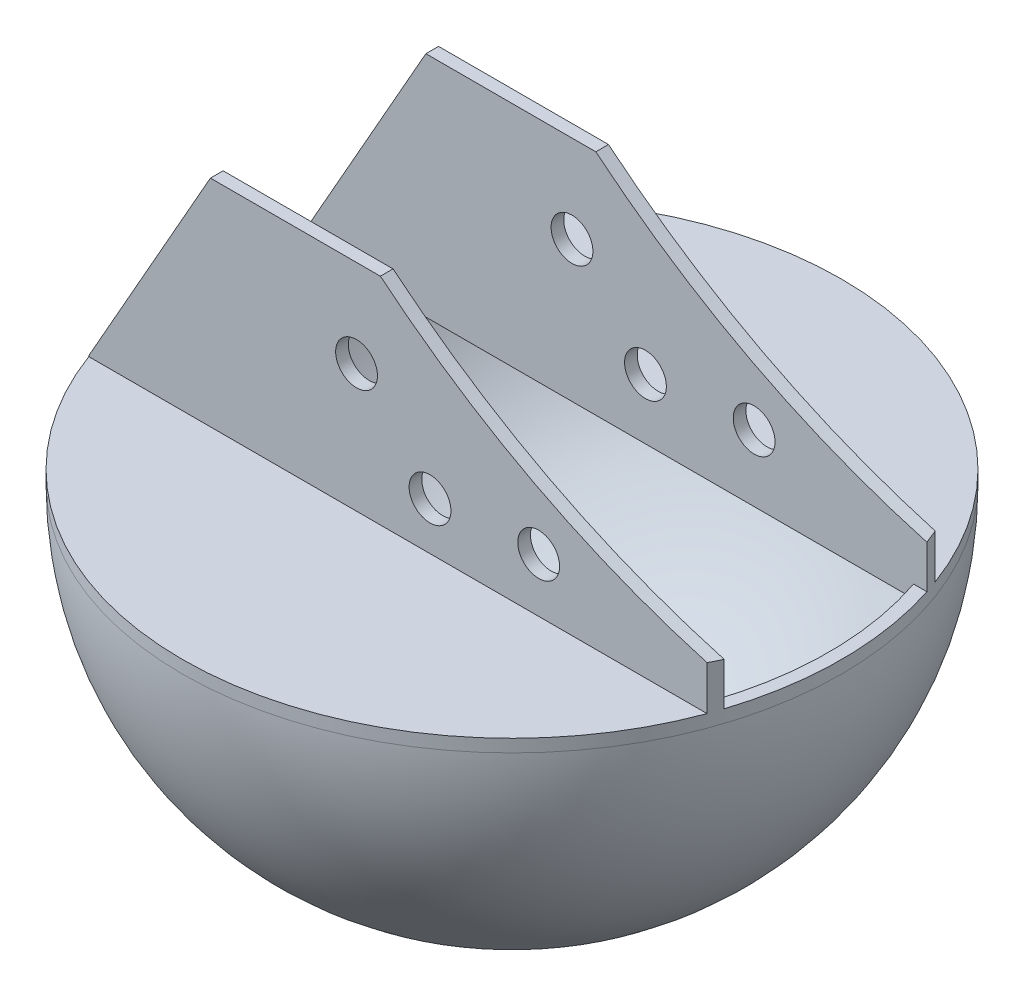
ISO-10303-21;
HEADER;
FILE_DESCRIPTION(('STEP AP214'),'2;1');
FILE_NAME('part.step','',(''),(''),'','','');
FILE_SCHEMA(('AUTOMOTIVE_DESIGN { 1 0 10303 214 1 1 1 1 }'));
ENDSEC;
DATA;
#1=APPLICATION_CONTEXT('core data for automotive mechanical design processes');
#2=APPLICATION_PROTOCOL_DEFINITION('international standard','automotive_design',2000,#1);
#3=PRODUCT_CONTEXT('',#1,'mechanical');
#4=PRODUCT('Part','Part','',(#3));
#5=PRODUCT_RELATED_PRODUCT_CATEGORY('part','',(#4));
#6=PRODUCT_DEFINITION_FORMATION('','',#4);
#7=PRODUCT_DEFINITION_CONTEXT('part definition',#1,'design');
#8=PRODUCT_DEFINITION('design','',#6,#7);
#9=PRODUCT_DEFINITION_SHAPE('','',#8);
#10=(LENGTH_UNIT() NAMED_UNIT(*) SI_UNIT(.MILLI.,.METRE.));
#11=(NAMED_UNIT(*) PLANE_ANGLE_UNIT() SI_UNIT($,.RADIAN.));
#12=(NAMED_UNIT(*) SI_UNIT($,.STERADIAN.) SOLID_ANGLE_UNIT());
#13=UNCERTAINTY_MEASURE_WITH_UNIT(LENGTH_MEASURE(1.E-05),#10,'distance_accuracy_value','');
#14=(GEOMETRIC_REPRESENTATION_CONTEXT(3) GLOBAL_UNCERTAINTY_ASSIGNED_CONTEXT((#13)) GLOBAL_UNIT_ASSIGNED_CONTEXT((#10,
#11,#12)) REPRESENTATION_CONTEXT('',''));
#15=CARTESIAN_POINT('',(0.,0.,0.));
#16=DIRECTION('',(0.,0.,1.));
#17=DIRECTION('',(1.,0.,0.));
#18=AXIS2_PLACEMENT_3D('',#15,#16,#17);
#19=CARTESIAN_POINT('',(-23.685438564654,0.,8.));
#20=DIRECTION('',(0.,0.,-1.));
#21=DIRECTION('',(-1.,0.,0.));
#22=AXIS2_PLACEMENT_3D('',#19,#20,#21);
#23=PLANE('',#22);
#24=CARTESIAN_POINT('',(43.7023148379366,72.6324172277184,8.));
#25=DIRECTION('',(0.,0.,-1.));
#26=DIRECTION('',(-1.,0.,0.));
#27=AXIS2_PLACEMENT_3D('',#24,#25,#26);
#28=CIRCLE('',#27,70.8348830128066);
#29=CARTESIAN_POINT('',(24.738633753706,4.38317216835103,7.99999999999999));
#30=VERTEX_POINT('',#29);
#31=CARTESIAN_POINT('',(-1.38515170537769,18.,8.00000000000017));
#32=VERTEX_POINT('',#31);
#33=EDGE_CURVE('E56',#30,#32,#28,.T.);
#34=ORIENTED_EDGE('',*,*,#33,.F.);
#35=DIRECTION('',(0.,-1.,0.));
#36=VECTOR('',#35,1.);
#37=CARTESIAN_POINT('',(24.738633753706,18.,7.99999999999999));
#38=LINE('',#37,#36);
#39=CARTESIAN_POINT('',(24.738633753706,1.,8.));
#40=VERTEX_POINT('',#39);
#41=EDGE_CURVE('E185',#30,#40,#38,.T.);
#42=ORIENTED_EDGE('',*,*,#41,.T.);
#43=DIRECTION('',(-1.,0.,0.));
#44=VECTOR('',#43,1.);
#45=CARTESIAN_POINT('',(23.685438564654,1.,8.));
#46=LINE('',#45,#44);
#47=CARTESIAN_POINT('',(23.685438564654,1.,8.));
#48=VERTEX_POINT('',#47);
#49=EDGE_CURVE('E181',#40,#48,#46,.T.);
#50=ORIENTED_EDGE('',*,*,#49,.T.);
#51=DIRECTION('',(0.,1.,0.));
#52=VECTOR('',#51,1.);
#53=CARTESIAN_POINT('',(23.685438564654,0.,8.));
#54=LINE('',#53,#52);
#55=CARTESIAN_POINT('',(23.685438564654,0.,8.));
#56=VERTEX_POINT('',#55);
#57=EDGE_CURVE('E295',#56,#48,#54,.T.);
#58=ORIENTED_EDGE('',*,*,#57,.F.);
#59=DIRECTION('',(-1.,0.,0.));
#60=VECTOR('',#59,1.);
#61=CARTESIAN_POINT('',(-23.685438564654,0.,8.));
#62=LINE('',#61,#60);
#63=CARTESIAN_POINT('',(-23.685438564654,0.,8.));
#64=VERTEX_POINT('',#63);
#65=EDGE_CURVE('E184',#56,#64,#62,.T.);
#66=ORIENTED_EDGE('',*,*,#65,.T.);
#67=DIRECTION('',(0.,1.,0.));
#68=VECTOR('',#67,1.);
#69=CARTESIAN_POINT('',(-23.685438564654,0.,8.));
#70=LINE('',#69,#68);
#71=CARTESIAN_POINT('',(-23.685438564654,1.,8.));
#72=VERTEX_POINT('',#71);
#73=EDGE_CURVE('E300',#64,#72,#70,.T.);
#74=ORIENTED_EDGE('',*,*,#73,.T.);
#75=CARTESIAN_POINT('',(-24.3926218353009,1.,8.));
#76=VERTEX_POINT('',#75);
#77=EDGE_CURVE('E186',#72,#76,#46,.T.);
#78=ORIENTED_EDGE('',*,*,#77,.T.);
#79=DIRECTION('',(-1.45758818449433E-13,-1.,0.));
#80=VECTOR('',#79,1.);
#81=CARTESIAN_POINT('',(-24.3926218353011,1.0307819795672E-13,8.));
#82=LINE('',#81,#80);
#83=CARTESIAN_POINT('',(-24.3926218353009,1.0714079667123,7.99999999999999));
#84=VERTEX_POINT('',#83);
#85=EDGE_CURVE('E326',#84,#76,#82,.T.);
#86=ORIENTED_EDGE('',*,*,#85,.F.);
#87=DIRECTION('',(-0.49316436078676,-0.869936154697451,0.));
#88=VECTOR('',#87,1.);
#89=CARTESIAN_POINT('',(-24.6802840847096,0.563975128899435,8.));
#90=LINE('',#89,#88);
#91=CARTESIAN_POINT('',(-14.7958505963591,18.,7.99999999999999));
#92=VERTEX_POINT('',#91);
#93=EDGE_CURVE('E210',#92,#84,#90,.T.);
#94=ORIENTED_EDGE('',*,*,#93,.F.);
#95=DIRECTION('',(-1.,0.,0.));
#96=VECTOR('',#95,1.);
#97=CARTESIAN_POINT('',(23.685438564654,18.,8.));
#98=LINE('',#97,#96);
#99=EDGE_CURVE('E176',#32,#92,#98,.T.);
#100=ORIENTED_EDGE('',*,*,#99,.F.);
#101=EDGE_LOOP('',(#34,#42,#50,#58,#66,#74,#78,#86,#94,#100));
#102=FACE_BOUND('',#101,.T.);
#103=CARTESIAN_POINT('',(11.1047679535459,5.24090867176932,8.));
#104=DIRECTION('',(0.,0.,-1.));
#105=DIRECTION('',(-1.,0.,0.));
#106=AXIS2_PLACEMENT_3D('',#103,#104,#105);
#107=CIRCLE('',#106,1.65000000000001);
#108=CARTESIAN_POINT('',(9.45476795354589,5.24090867176932,8.));
#109=VERTEX_POINT('',#108);
#110=EDGE_CURVE('E222',#109,#109,#107,.T.);
#111=ORIENTED_EDGE('',*,*,#110,.F.);
#112=EDGE_LOOP('',(#111));
#113=FACE_BOUND('',#112,.T.);
#114=CARTESIAN_POINT('',(2.530016956755,4.74483930901942,8.));
#115=DIRECTION('',(0.,0.,-1.));
#116=DIRECTION('',(-1.,0.,0.));
#117=AXIS2_PLACEMENT_3D('',#114,#115,#116);
#118=CIRCLE('',#117,1.65000000000001);
#119=CARTESIAN_POINT('',(0.880016956754995,4.74483930901942,8.));
#120=VERTEX_POINT('',#119);
#121=EDGE_CURVE('E238',#120,#120,#118,.T.);
#122=ORIENTED_EDGE('',*,*,#121,.F.);
#123=EDGE_LOOP('',(#122));
#124=FACE_BOUND('',#123,.T.);
#125=CARTESIAN_POINT('',(-3.26661902804232,11.0829345062674,8.));
#126=DIRECTION('',(0.,0.,-1.));
#127=DIRECTION('',(-1.,0.,0.));
#128=AXIS2_PLACEMENT_3D('',#125,#126,#127);
#129=CIRCLE('',#128,1.65);
#130=CARTESIAN_POINT('',(-4.91661902804231,11.0829345062674,8.));
#131=VERTEX_POINT('',#130);
#132=EDGE_CURVE('E234',#131,#131,#129,.T.);
#133=ORIENTED_EDGE('',*,*,#132,.F.);
#134=EDGE_LOOP('',(#133));
#135=FACE_BOUND('',#134,.T.);
#136=ADVANCED_FACE('F42',(#102,#113,#124,#135),#23,.T.);
#137=CARTESIAN_POINT('',(-23.685438564654,0.,-8.));
#138=DIRECTION('',(0.,0.,1.));
#139=DIRECTION('',(1.,0.,0.));
#140=AXIS2_PLACEMENT_3D('',#137,#138,#139);
#141=PLANE('',#140);
#142=CARTESIAN_POINT('',(43.7023148379366,72.6324172277184,-8.));
#143=DIRECTION('',(0.,0.,1.));
#144=DIRECTION('',(1.,0.,0.));
#145=AXIS2_PLACEMENT_3D('',#142,#143,#144);
#146=CIRCLE('',#145,70.8348830128066);
#147=CARTESIAN_POINT('',(-1.38515170537769,18.,-7.99999999999999));
#148=VERTEX_POINT('',#147);
#149=CARTESIAN_POINT('',(24.738633753706,4.38317216835103,-8.));
#150=VERTEX_POINT('',#149);
#151=EDGE_CURVE('E348',#148,#150,#146,.T.);
#152=ORIENTED_EDGE('',*,*,#151,.F.);
#153=DIRECTION('',(1.,0.,0.));
#154=VECTOR('',#153,1.);
#155=CARTESIAN_POINT('',(23.685438564654,18.,-8.));
#156=LINE('',#155,#154);
#157=CARTESIAN_POINT('',(-14.7958505963591,18.,-7.99999999999999));
#158=VERTEX_POINT('',#157);
#159=EDGE_CURVE('E207',#158,#148,#156,.T.);
#160=ORIENTED_EDGE('',*,*,#159,.F.);
#161=DIRECTION('',(0.49316436078676,0.869936154697451,0.));
#162=VECTOR('',#161,1.);
#163=CARTESIAN_POINT('',(-24.6802840847096,0.563975128899435,-8.));
#164=LINE('',#163,#162);
#165=CARTESIAN_POINT('',(-24.3926218353009,1.0714079667123,-8.));
#166=VERTEX_POINT('',#165);
#167=EDGE_CURVE('E206',#166,#158,#164,.T.);
#168=ORIENTED_EDGE('',*,*,#167,.F.);
#169=DIRECTION('',(1.45758818449433E-13,1.,0.));
#170=VECTOR('',#169,1.);
#171=CARTESIAN_POINT('',(-24.3926218353011,1.0307819795672E-13,-8.));
#172=LINE('',#171,#170);
#173=CARTESIAN_POINT('',(-24.3926218353009,1.,-8.00000000000032));
#174=VERTEX_POINT('',#173);
#175=EDGE_CURVE('E332',#174,#166,#172,.T.);
#176=ORIENTED_EDGE('',*,*,#175,.F.);
#177=DIRECTION('',(1.,0.,0.));
#178=VECTOR('',#177,1.);
#179=CARTESIAN_POINT('',(23.685438564654,1.,-8.));
#180=LINE('',#179,#178);
#181=CARTESIAN_POINT('',(-23.685438564654,1.,-8.));
#182=VERTEX_POINT('',#181);
#183=EDGE_CURVE('E200',#174,#182,#180,.T.);
#184=ORIENTED_EDGE('',*,*,#183,.T.);
#185=DIRECTION('',(0.,1.,0.));
#186=VECTOR('',#185,1.);
#187=CARTESIAN_POINT('',(-23.685438564654,0.,-8.));
#188=LINE('',#187,#186);
#189=CARTESIAN_POINT('',(-23.685438564654,0.,-8.));
#190=VERTEX_POINT('',#189);
#191=EDGE_CURVE('E258',#190,#182,#188,.T.);
#192=ORIENTED_EDGE('',*,*,#191,.F.);
#193=DIRECTION('',(1.,0.,0.));
#194=VECTOR('',#193,1.);
#195=CARTESIAN_POINT('',(-23.685438564654,0.,-8.));
#196=LINE('',#195,#194);
#197=CARTESIAN_POINT('',(23.685438564654,0.,-8.));
#198=VERTEX_POINT('',#197);
#199=EDGE_CURVE('E202',#190,#198,#196,.T.);
#200=ORIENTED_EDGE('',*,*,#199,.T.);
#201=DIRECTION('',(0.,1.,0.));
#202=VECTOR('',#201,1.);
#203=CARTESIAN_POINT('',(23.685438564654,0.,-8.));
#204=LINE('',#203,#202);
#205=CARTESIAN_POINT('',(23.685438564654,1.,-8.));
#206=VERTEX_POINT('',#205);
#207=EDGE_CURVE('E276',#198,#206,#204,.T.);
#208=ORIENTED_EDGE('',*,*,#207,.T.);
#209=CARTESIAN_POINT('',(24.738633753706,1.,-7.99999999999999));
#210=VERTEX_POINT('',#209);
#211=EDGE_CURVE('E203',#206,#210,#180,.T.);
#212=ORIENTED_EDGE('',*,*,#211,.T.);
#213=DIRECTION('',(0.,-1.,0.));
#214=VECTOR('',#213,1.);
#215=CARTESIAN_POINT('',(24.738633753706,18.,-7.99999999999999));
#216=LINE('',#215,#214);
#217=EDGE_CURVE('E196',#150,#210,#216,.T.);
#218=ORIENTED_EDGE('',*,*,#217,.F.);
#219=EDGE_LOOP('',(#152,#160,#168,#176,#184,#192,#200,#208,#212,#218));
#220=FACE_BOUND('',#219,.T.);
#221=CARTESIAN_POINT('',(11.1047679535459,5.24090867176932,-8.));
#222=DIRECTION('',(0.,0.,1.));
#223=DIRECTION('',(1.,0.,0.));
#224=AXIS2_PLACEMENT_3D('',#221,#222,#223);
#225=CIRCLE('',#224,1.65000000000001);
#226=CARTESIAN_POINT('',(12.7547679535459,5.24090867176932,-8.));
#227=VERTEX_POINT('',#226);
#228=EDGE_CURVE('E237',#227,#227,#225,.T.);
#229=ORIENTED_EDGE('',*,*,#228,.F.);
#230=EDGE_LOOP('',(#229));
#231=FACE_BOUND('',#230,.T.);
#232=CARTESIAN_POINT('',(2.530016956755,4.74483930901942,-8.));
#233=DIRECTION('',(0.,0.,1.));
#234=DIRECTION('',(1.,0.,0.));
#235=AXIS2_PLACEMENT_3D('',#232,#233,#234);
#236=CIRCLE('',#235,1.65000000000001);
#237=CARTESIAN_POINT('',(4.18001695675501,4.74483930901942,-8.));
#238=VERTEX_POINT('',#237);
#239=EDGE_CURVE('E233',#238,#238,#236,.T.);
#240=ORIENTED_EDGE('',*,*,#239,.F.);
#241=EDGE_LOOP('',(#240));
#242=FACE_BOUND('',#241,.T.);
#243=CARTESIAN_POINT('',(-3.26661902804232,11.0829345062674,-8.));
#244=DIRECTION('',(0.,0.,1.));
#245=DIRECTION('',(1.,0.,0.));
#246=AXIS2_PLACEMENT_3D('',#243,#244,#245);
#247=CIRCLE('',#246,1.65);
#248=CARTESIAN_POINT('',(-1.61661902804232,11.0829345062674,-8.));
#249=VERTEX_POINT('',#248);
#250=EDGE_CURVE('E228',#249,#249,#247,.T.);
#251=ORIENTED_EDGE('',*,*,#250,.F.);
#252=EDGE_LOOP('',(#251));
#253=FACE_BOUND('',#252,.T.);
#254=ADVANCED_FACE('F370',(#220,#231,#242,#253),#141,.T.);
#255=CARTESIAN_POINT('',(0.,1.,0.));
#256=DIRECTION('',(0.,1.,0.));
#257=DIRECTION('',(0.,0.,1.));
#258=AXIS2_PLACEMENT_3D('',#255,#256,#257);
#259=PLANE('',#258);
#260=DIRECTION('',(-1.,0.,0.));
#261=VECTOR('',#260,1.);
#262=CARTESIAN_POINT('',(-24.3926218353009,1.,-8.99999999999999));
#263=LINE('',#262,#261);
#264=CARTESIAN_POINT('',(24.3926218353009,1.,-8.99999999999999));
#265=VERTEX_POINT('',#264);
#266=CARTESIAN_POINT('',(-24.3926218353009,1.,-8.99999999999999));
#267=VERTEX_POINT('',#266);
#268=EDGE_CURVE('E174',#265,#267,#263,.T.);
#269=ORIENTED_EDGE('',*,*,#268,.F.);
#270=CARTESIAN_POINT('',(0.,1.,0.));
#271=DIRECTION('',(0.,1.,0.));
#272=DIRECTION('',(0.,0.,1.));
#273=AXIS2_PLACEMENT_3D('',#270,#271,#272);
#274=CIRCLE('',#273,26.);
#275=EDGE_CURVE('E263',#265,#267,#274,.T.);
#276=ORIENTED_EDGE('',*,*,#275,.T.);
#277=EDGE_LOOP('',(#269,#276));
#278=FACE_BOUND('',#277,.T.);
#279=ADVANCED_FACE('F421',(#278),#259,.T.);
#280=ORIENTED_EDGE('',*,*,#183,.F.);
#281=DIRECTION('',(0.,0.,1.));
#282=VECTOR('',#281,1.);
#283=CARTESIAN_POINT('',(-24.3926218353009,1.,-15.));
#284=LINE('',#283,#282);
#285=EDGE_CURVE('E337',#267,#174,#284,.T.);
#286=ORIENTED_EDGE('',*,*,#285,.F.);
#287=CARTESIAN_POINT('',(-24.3926218353009,1.,8.99999999999999));
#288=VERTEX_POINT('',#287);
#289=EDGE_CURVE('E257',#267,#288,#274,.T.);
#290=ORIENTED_EDGE('',*,*,#289,.T.);
#291=EDGE_CURVE('E335',#76,#288,#284,.T.);
#292=ORIENTED_EDGE('',*,*,#291,.F.);
#293=ORIENTED_EDGE('',*,*,#77,.F.);
#294=CARTESIAN_POINT('',(0.,1.,0.));
#295=DIRECTION('',(0.,1.,0.));
#296=DIRECTION('',(0.,0.,1.));
#297=AXIS2_PLACEMENT_3D('',#294,#295,#296);
#298=CIRCLE('',#297,25.);
#299=EDGE_CURVE('E261',#182,#72,#298,.T.);
#300=ORIENTED_EDGE('',*,*,#299,.F.);
#301=EDGE_LOOP('',(#280,#286,#290,#292,#293,#300));
#302=FACE_BOUND('',#301,.T.);
#303=ADVANCED_FACE('F387',(#302),#259,.T.);
#304=DIRECTION('',(1.,0.,0.));
#305=VECTOR('',#304,1.);
#306=CARTESIAN_POINT('',(-24.3926218353009,1.,8.99999999999999));
#307=LINE('',#306,#305);
#308=CARTESIAN_POINT('',(24.3926218353009,1.,8.99999999999999));
#309=VERTEX_POINT('',#308);
#310=EDGE_CURVE('E187',#288,#309,#307,.T.);
#311=ORIENTED_EDGE('',*,*,#310,.F.);
#312=EDGE_CURVE('E251',#288,#309,#274,.T.);
#313=ORIENTED_EDGE('',*,*,#312,.T.);
#314=EDGE_LOOP('',(#311,#313));
#315=FACE_BOUND('',#314,.T.);
#316=ADVANCED_FACE('F250',(#315),#259,.T.);
#317=CARTESIAN_POINT('',(0.,1.,0.));
#318=DIRECTION('',(0.,-1.,0.));
#319=DIRECTION('',(0.,0.,-1.));
#320=AXIS2_PLACEMENT_3D('',#317,#318,#319);
#321=CYLINDRICAL_SURFACE('',#320,25.);
#322=ORIENTED_EDGE('',*,*,#191,.T.);
#323=ORIENTED_EDGE('',*,*,#299,.T.);
#324=ORIENTED_EDGE('',*,*,#73,.F.);
#325=CARTESIAN_POINT('',(0.,0.,0.));
#326=DIRECTION('',(0.,1.,0.));
#327=DIRECTION('',(0.,0.,1.));
#328=AXIS2_PLACEMENT_3D('',#325,#326,#327);
#329=CIRCLE('',#328,25.);
#330=EDGE_CURVE('E288',#190,#64,#329,.T.);
#331=ORIENTED_EDGE('',*,*,#330,.F.);
#332=EDGE_LOOP('',(#322,#323,#324,#331));
#333=FACE_BOUND('',#332,.T.);
#334=ADVANCED_FACE('F394',(#333),#321,.F.);
#335=CARTESIAN_POINT('',(0.,0.,0.));
#336=DIRECTION('',(0.,1.,0.));
#337=DIRECTION('',(1.,0.,0.));
#338=AXIS2_PLACEMENT_3D('',#335,#336,#337);
#339=SPHERICAL_SURFACE('',#338,26.);
#340=CARTESIAN_POINT('',(0.,0.,0.));
#341=DIRECTION('',(0.,1.,0.));
#342=DIRECTION('',(0.,0.,1.));
#343=AXIS2_PLACEMENT_3D('',#340,#341,#342);
#344=CIRCLE('',#343,26.);
#345=CARTESIAN_POINT('',(0.,0.,26.));
#346=VERTEX_POINT('',#345);
#347=EDGE_CURVE('E219',#346,#346,#344,.T.);
#348=ORIENTED_EDGE('',*,*,#347,.F.);
#349=EDGE_LOOP('',(#348));
#350=FACE_BOUND('',#349,.T.);
#351=ADVANCED_FACE('F605',(#350),#339,.T.);
#352=ORIENTED_EDGE('',*,*,#211,.F.);
#353=EDGE_CURVE('E272',#48,#206,#298,.T.);
#354=ORIENTED_EDGE('',*,*,#353,.F.);
#355=ORIENTED_EDGE('',*,*,#49,.F.);
#356=EDGE_CURVE('E224',#40,#210,#274,.T.);
#357=ORIENTED_EDGE('',*,*,#356,.T.);
#358=EDGE_LOOP('',(#352,#354,#355,#357));
#359=FACE_BOUND('',#358,.T.);
#360=ADVANCED_FACE('F399',(#359),#259,.T.);
#361=CARTESIAN_POINT('',(0.,1.,0.));
#362=DIRECTION('',(0.,-1.,0.));
#363=DIRECTION('',(0.,0.,-1.));
#364=AXIS2_PLACEMENT_3D('',#361,#362,#363);
#365=CYLINDRICAL_SURFACE('',#364,26.);
#366=DIRECTION('',(0.,-1.,0.));
#367=VECTOR('',#366,1.);
#368=CARTESIAN_POINT('',(24.3926218353009,18.,-8.99999999999999));
#369=LINE('',#368,#367);
#370=CARTESIAN_POINT('',(24.3926218353009,4.48026093327714,-8.99999999999999));
#371=VERTEX_POINT('',#370);
#372=EDGE_CURVE('E172',#371,#265,#369,.T.);
#373=ORIENTED_EDGE('',*,*,#372,.F.);
#374=CARTESIAN_POINT('',(23.0651251893416,4.87042895371695,-12.));
#375=CARTESIAN_POINT('',(23.2316855557632,4.81970533224708,-11.6798706596151));
#376=CARTESIAN_POINT('',(23.3917396279807,4.77162827203275,-11.3559382741795));
#377=CARTESIAN_POINT('',(23.6981725724189,4.68066567135373,-10.7017173082048));
#378=CARTESIAN_POINT('',(23.8445768646514,4.63777043483787,-10.3714419825001));
#379=CARTESIAN_POINT('',(24.1236835953816,4.55687849553774,-9.70456330835858));
#380=CARTESIAN_POINT('',(24.256386045794,4.51888178849383,-9.36795996542481));
#381=CARTESIAN_POINT('',(24.5080178236296,4.4475463852596,-8.68842162294103));
#382=CARTESIAN_POINT('',(24.6269204353232,4.41421669924316,-8.34547578441792));
#383=CARTESIAN_POINT('',(24.738633753706,4.38317216835103,-8.));
#384=B_SPLINE_CURVE_WITH_KNOTS('',3,(#374,#375,#376,#377,#378,#379,#380,#381,#382,#383),
.UNSPECIFIED.,.F.,.F.,(4,2,2,2,4),(0.,1.09315483432454,2.18423142568867,3.27530706827258,
4.36846093102751),.UNSPECIFIED.);
#385=EDGE_CURVE('E359',#371,#150,#384,.T.);
#386=ORIENTED_EDGE('',*,*,#385,.T.);
#387=ORIENTED_EDGE('',*,*,#217,.T.);
#388=ORIENTED_EDGE('',*,*,#356,.F.);
#389=ORIENTED_EDGE('',*,*,#41,.F.);
#390=CARTESIAN_POINT('',(24.738633753706,4.38317216835103,8.));
#391=CARTESIAN_POINT('',(24.6843240159089,4.39825346920659,8.16793570455722));
#392=CARTESIAN_POINT('',(24.6283348204764,4.41388485004495,8.33523689016994));
#393=CARTESIAN_POINT('',(24.5129975143413,4.446247771687,8.66857022350325));
#394=CARTESIAN_POINT('',(24.4536494036388,4.46297931249067,8.83460237122386));
#395=CARTESIAN_POINT('',(24.3926218353009,4.48026093327713,9.));
#396=B_SPLINE_CURVE_WITH_KNOTS('',3,(#390,#391,#392,#393,#394,#395),.UNSPECIFIED.,.F.,.F.,(4,2,
4),(0.,0.531337323190933,1.06267464637178),.UNSPECIFIED.);
#397=CARTESIAN_POINT('',(24.3926218353009,4.48026093327714,8.99999999999999));
#398=VERTEX_POINT('',#397);
#399=EDGE_CURVE('E341',#30,#398,#396,.T.);
#400=ORIENTED_EDGE('',*,*,#399,.T.);
#401=DIRECTION('',(0.,-1.,0.));
#402=VECTOR('',#401,1.);
#403=CARTESIAN_POINT('',(24.3926218353009,18.,8.99999999999999));
#404=LINE('',#403,#402);
#405=EDGE_CURVE('E166',#398,#309,#404,.T.);
#406=ORIENTED_EDGE('',*,*,#405,.T.);
#407=ORIENTED_EDGE('',*,*,#312,.F.);
#408=ORIENTED_EDGE('',*,*,#289,.F.);
#409=ORIENTED_EDGE('',*,*,#275,.F.);
#410=EDGE_LOOP('',(#373,#386,#387,#388,#389,#400,#406,#407,#408,#409));
#411=FACE_BOUND('',#410,.T.);
#412=ORIENTED_EDGE('',*,*,#347,.T.);
#413=EDGE_LOOP('',(#412));
#414=FACE_BOUND('',#413,.T.);
#415=ADVANCED_FACE('F254',(#411,#414),#365,.T.);
#416=ORIENTED_EDGE('',*,*,#207,.F.);
#417=EDGE_CURVE('E289',#56,#198,#329,.T.);
#418=ORIENTED_EDGE('',*,*,#417,.F.);
#419=ORIENTED_EDGE('',*,*,#57,.T.);
#420=ORIENTED_EDGE('',*,*,#353,.T.);
#421=EDGE_LOOP('',(#416,#418,#419,#420));
#422=FACE_BOUND('',#421,.T.);
#423=ADVANCED_FACE('F398',(#422),#321,.F.);
#424=CARTESIAN_POINT('',(0.,0.,0.));
#425=DIRECTION('',(0.,0.,-1.));
#426=DIRECTION('',(1.,0.,0.));
#427=AXIS2_PLACEMENT_3D('',#424,#425,#426);
#428=SPHERICAL_SURFACE('',#427,25.);
#429=CARTESIAN_POINT('',(0.,0.,0.));
#430=DIRECTION('',(0.,1.,0.));
#431=DIRECTION('',(0.,0.,1.));
#432=AXIS2_PLACEMENT_3D('',#429,#430,#431);
#433=SPHERICAL_SURFACE('',#432,25.);
#434=ORIENTED_EDGE('',*,*,#417,.T.);
#435=CARTESIAN_POINT('',(0.,0.,0.));
#436=DIRECTION('',(0.,1.,0.));
#437=DIRECTION('',(0.,0.,1.));
#438=AXIS2_PLACEMENT_3D('',#435,#436,#437);
#439=CIRCLE('',#438,25.);
#440=EDGE_CURVE('E286',#198,#190,#439,.T.);
#441=ORIENTED_EDGE('',*,*,#440,.T.);
#442=ORIENTED_EDGE('',*,*,#330,.T.);
#443=CARTESIAN_POINT('',(0.,0.,0.));
#444=DIRECTION('',(0.,1.,0.));
#445=DIRECTION('',(0.,0.,1.));
#446=AXIS2_PLACEMENT_3D('',#443,#444,#445);
#447=CIRCLE('',#446,25.);
#448=EDGE_CURVE('E192',#64,#56,#447,.T.);
#449=ORIENTED_EDGE('',*,*,#448,.T.);
#450=EDGE_LOOP('',(#434,#441,#442,#449));
#451=FACE_BOUND('',#450,.T.);
#452=ADVANCED_FACE('F396',(#451),#433,.F.);
#453=CARTESIAN_POINT('',(0.,0.,0.));
#454=DIRECTION('',(0.,1.,0.));
#455=DIRECTION('',(0.,0.,1.));
#456=AXIS2_PLACEMENT_3D('',#453,#454,#455);
#457=PLANE('',#456);
#458=ORIENTED_EDGE('',*,*,#448,.F.);
#459=ORIENTED_EDGE('',*,*,#65,.F.);
#460=EDGE_LOOP('',(#458,#459));
#461=FACE_BOUND('',#460,.T.);
#462=ADVANCED_FACE('F404',(#461),#457,.F.);
#463=CARTESIAN_POINT('',(0.,0.,0.));
#464=DIRECTION('',(0.,1.,0.));
#465=DIRECTION('',(0.,0.,1.));
#466=AXIS2_PLACEMENT_3D('',#463,#464,#465);
#467=PLANE('',#466);
#468=ORIENTED_EDGE('',*,*,#440,.F.);
#469=ORIENTED_EDGE('',*,*,#199,.F.);
#470=EDGE_LOOP('',(#468,#469));
#471=FACE_BOUND('',#470,.T.);
#472=ADVANCED_FACE('F406',(#471),#467,.F.);
#473=CARTESIAN_POINT('',(-24.3926218353009,18.,8.99999999999999));
#474=DIRECTION('',(0.,0.,-1.));
#475=DIRECTION('',(-1.,0.,0.));
#476=AXIS2_PLACEMENT_3D('',#473,#474,#475);
#477=PLANE('',#476);
#478=CARTESIAN_POINT('',(11.1047679535459,5.24090867176932,8.99999999999999));
#479=DIRECTION('',(0.,0.,1.));
#480=DIRECTION('',(1.,0.,0.));
#481=AXIS2_PLACEMENT_3D('',#478,#479,#480);
#482=CIRCLE('',#481,1.65000000000001);
#483=CARTESIAN_POINT('',(12.7547679535459,5.24090867176932,8.99999999999999));
#484=VERTEX_POINT('',#483);
#485=EDGE_CURVE('E229',#484,#484,#482,.T.);
#486=ORIENTED_EDGE('',*,*,#485,.F.);
#487=EDGE_LOOP('',(#486));
#488=FACE_BOUND('',#487,.T.);
#489=CARTESIAN_POINT('',(2.530016956755,4.74483930901942,8.99999999999999));
#490=DIRECTION('',(0.,0.,1.));
#491=DIRECTION('',(1.,0.,0.));
#492=AXIS2_PLACEMENT_3D('',#489,#490,#491);
#493=CIRCLE('',#492,1.65000000000001);
#494=CARTESIAN_POINT('',(4.18001695675501,4.74483930901942,8.99999999999999));
#495=VERTEX_POINT('',#494);
#496=EDGE_CURVE('E325',#495,#495,#493,.T.);
#497=ORIENTED_EDGE('',*,*,#496,.F.);
#498=EDGE_LOOP('',(#497));
#499=FACE_BOUND('',#498,.T.);
#500=CARTESIAN_POINT('',(-3.26661902804232,11.0829345062674,8.99999999999999));
#501=DIRECTION('',(0.,0.,1.));
#502=DIRECTION('',(1.,0.,0.));
#503=AXIS2_PLACEMENT_3D('',#500,#501,#502);
#504=CIRCLE('',#503,1.65);
#505=CARTESIAN_POINT('',(-1.61661902804232,11.0829345062674,8.99999999999999));
#506=VERTEX_POINT('',#505);
#507=EDGE_CURVE('E322',#506,#506,#504,.T.);
#508=ORIENTED_EDGE('',*,*,#507,.F.);
#509=EDGE_LOOP('',(#508));
#510=FACE_BOUND('',#509,.T.);
#511=ORIENTED_EDGE('',*,*,#405,.F.);
#512=CARTESIAN_POINT('',(43.7023148379366,72.6324172277184,8.99999999999999));
#513=DIRECTION('',(0.,0.,1.));
#514=DIRECTION('',(1.,0.,0.));
#515=AXIS2_PLACEMENT_3D('',#512,#513,#514);
#516=CIRCLE('',#515,70.8348830128066);
#517=CARTESIAN_POINT('',(-1.38515170537769,18.,8.99999999999999));
#518=VERTEX_POINT('',#517);
#519=EDGE_CURVE('E153',#518,#398,#516,.T.);
#520=ORIENTED_EDGE('',*,*,#519,.F.);
#521=DIRECTION('',(1.,0.,0.));
#522=VECTOR('',#521,1.);
#523=CARTESIAN_POINT('',(-24.3926218353009,18.,8.99999999999999));
#524=LINE('',#523,#522);
#525=CARTESIAN_POINT('',(-14.7958505963591,18.,8.99999999999999));
#526=VERTEX_POINT('',#525);
#527=EDGE_CURVE('E164',#526,#518,#524,.T.);
#528=ORIENTED_EDGE('',*,*,#527,.F.);
#529=DIRECTION('',(0.49316436078676,0.869936154697451,0.));
#530=VECTOR('',#529,1.);
#531=CARTESIAN_POINT('',(-14.7958505963591,18.,8.99999999999999));
#532=LINE('',#531,#530);
#533=CARTESIAN_POINT('',(-24.3926218353009,1.0714079667123,8.99999999999999));
#534=VERTEX_POINT('',#533);
#535=EDGE_CURVE('E213',#534,#526,#532,.T.);
#536=ORIENTED_EDGE('',*,*,#535,.F.);
#537=DIRECTION('',(0.,-1.,0.));
#538=VECTOR('',#537,1.);
#539=CARTESIAN_POINT('',(-24.3926218353009,18.,9.00000000000001));
#540=LINE('',#539,#538);
#541=EDGE_CURVE('E189',#534,#288,#540,.T.);
#542=ORIENTED_EDGE('',*,*,#541,.T.);
#543=ORIENTED_EDGE('',*,*,#310,.T.);
#544=EDGE_LOOP('',(#511,#520,#528,#536,#542,#543));
#545=FACE_BOUND('',#544,.T.);
#546=ADVANCED_FACE('F162',(#488,#499,#510,#545),#477,.F.);
#547=CARTESIAN_POINT('',(0.,18.,0.));
#548=DIRECTION('',(0.,-1.,0.));
#549=DIRECTION('',(0.,0.,-1.));
#550=AXIS2_PLACEMENT_3D('',#547,#548,#549);
#551=PLANE('',#550);
#552=ORIENTED_EDGE('',*,*,#527,.T.);
#553=DIRECTION('',(0.,0.,1.));
#554=VECTOR('',#553,1.);
#555=CARTESIAN_POINT('',(-1.38515170537769,18.,-12.));
#556=LINE('',#555,#554);
#557=EDGE_CURVE('E150',#32,#518,#556,.T.);
#558=ORIENTED_EDGE('',*,*,#557,.F.);
#559=ORIENTED_EDGE('',*,*,#99,.T.);
#560=DIRECTION('',(0.,0.,1.));
#561=VECTOR('',#560,1.);
#562=CARTESIAN_POINT('',(-14.7958505963591,18.,-27.));
#563=LINE('',#562,#561);
#564=EDGE_CURVE('E171',#92,#526,#563,.T.);
#565=ORIENTED_EDGE('',*,*,#564,.T.);
#566=EDGE_LOOP('',(#552,#558,#559,#565));
#567=FACE_BOUND('',#566,.T.);
#568=ADVANCED_FACE('F169',(#567),#551,.F.);
#569=CARTESIAN_POINT('',(-24.3926218353009,18.,-8.99999999999999));
#570=DIRECTION('',(0.,0.,1.));
#571=DIRECTION('',(1.,0.,0.));
#572=AXIS2_PLACEMENT_3D('',#569,#570,#571);
#573=PLANE('',#572);
#574=CARTESIAN_POINT('',(11.1047679535459,5.24090867176932,-8.99999999999999));
#575=DIRECTION('',(0.,0.,1.));
#576=DIRECTION('',(1.,0.,0.));
#577=AXIS2_PLACEMENT_3D('',#574,#575,#576);
#578=CIRCLE('',#577,1.65000000000001);
#579=CARTESIAN_POINT('',(12.7547679535459,5.24090867176932,-8.99999999999999));
#580=VERTEX_POINT('',#579);
#581=EDGE_CURVE('E235',#580,#580,#578,.T.);
#582=ORIENTED_EDGE('',*,*,#581,.T.);
#583=EDGE_LOOP('',(#582));
#584=FACE_BOUND('',#583,.T.);
#585=CARTESIAN_POINT('',(2.530016956755,4.74483930901942,-8.99999999999999));
#586=DIRECTION('',(0.,0.,1.));
#587=DIRECTION('',(1.,0.,0.));
#588=AXIS2_PLACEMENT_3D('',#585,#586,#587);
#589=CIRCLE('',#588,1.65000000000001);
#590=CARTESIAN_POINT('',(4.18001695675501,4.74483930901942,-8.99999999999999));
#591=VERTEX_POINT('',#590);
#592=EDGE_CURVE('E230',#591,#591,#589,.T.);
#593=ORIENTED_EDGE('',*,*,#592,.T.);
#594=EDGE_LOOP('',(#593));
#595=FACE_BOUND('',#594,.T.);
#596=CARTESIAN_POINT('',(-3.26661902804232,11.0829345062674,-8.99999999999999));
#597=DIRECTION('',(0.,0.,1.));
#598=DIRECTION('',(1.,0.,0.));
#599=AXIS2_PLACEMENT_3D('',#596,#597,#598);
#600=CIRCLE('',#599,1.65);
#601=CARTESIAN_POINT('',(-1.61661902804232,11.0829345062674,-8.99999999999999));
#602=VERTEX_POINT('',#601);
#603=EDGE_CURVE('E225',#602,#602,#600,.T.);
#604=ORIENTED_EDGE('',*,*,#603,.T.);
#605=EDGE_LOOP('',(#604));
#606=FACE_BOUND('',#605,.T.);
#607=DIRECTION('',(-1.,0.,0.));
#608=VECTOR('',#607,1.);
#609=CARTESIAN_POINT('',(-24.3926218353009,18.,-8.99999999999999));
#610=LINE('',#609,#608);
#611=CARTESIAN_POINT('',(-1.38515170537769,18.,-8.99999999999999));
#612=VERTEX_POINT('',#611);
#613=CARTESIAN_POINT('',(-14.7958505963591,18.,-8.99999999999999));
#614=VERTEX_POINT('',#613);
#615=EDGE_CURVE('E204',#612,#614,#610,.T.);
#616=ORIENTED_EDGE('',*,*,#615,.F.);
#617=CARTESIAN_POINT('',(43.7023148379366,72.6324172277184,-8.99999999999999));
#618=DIRECTION('',(0.,0.,1.));
#619=DIRECTION('',(1.,0.,0.));
#620=AXIS2_PLACEMENT_3D('',#617,#618,#619);
#621=CIRCLE('',#620,70.8348830128066);
#622=EDGE_CURVE('E63',#612,#371,#621,.T.);
#623=ORIENTED_EDGE('',*,*,#622,.T.);
#624=ORIENTED_EDGE('',*,*,#372,.T.);
#625=ORIENTED_EDGE('',*,*,#268,.T.);
#626=DIRECTION('',(0.,-1.,0.));
#627=VECTOR('',#626,1.);
#628=CARTESIAN_POINT('',(-24.3926218353009,18.,-8.99999999999999));
#629=LINE('',#628,#627);
#630=CARTESIAN_POINT('',(-24.3926218353009,1.0714079667123,-8.99999999999999));
#631=VERTEX_POINT('',#630);
#632=EDGE_CURVE('E193',#631,#267,#629,.T.);
#633=ORIENTED_EDGE('',*,*,#632,.F.);
#634=DIRECTION('',(0.49316436078676,0.869936154697451,0.));
#635=VECTOR('',#634,1.);
#636=CARTESIAN_POINT('',(-17.1298917586753,13.8827787344331,-8.99999999999999));
#637=LINE('',#636,#635);
#638=EDGE_CURVE('E199',#631,#614,#637,.T.);
#639=ORIENTED_EDGE('',*,*,#638,.T.);
#640=EDGE_LOOP('',(#616,#623,#624,#625,#633,#639));
#641=FACE_BOUND('',#640,.T.);
#642=ADVANCED_FACE('F368',(#584,#595,#606,#641),#573,.F.);
#643=CARTESIAN_POINT('',(0.,18.,0.));
#644=DIRECTION('',(0.,1.,0.));
#645=DIRECTION('',(0.,0.,1.));
#646=AXIS2_PLACEMENT_3D('',#643,#644,#645);
#647=PLANE('',#646);
#648=DIRECTION('',(0.,0.,1.));
#649=VECTOR('',#648,1.);
#650=CARTESIAN_POINT('',(-1.38515170537769,18.,0.));
#651=LINE('',#650,#649);
#652=EDGE_CURVE('E12',#612,#148,#651,.T.);
#653=ORIENTED_EDGE('',*,*,#652,.F.);
#654=ORIENTED_EDGE('',*,*,#615,.T.);
#655=DIRECTION('',(0.,0.,-1.));
#656=VECTOR('',#655,1.);
#657=CARTESIAN_POINT('',(-14.7958505963591,18.,0.));
#658=LINE('',#657,#656);
#659=EDGE_CURVE('E215',#158,#614,#658,.T.);
#660=ORIENTED_EDGE('',*,*,#659,.F.);
#661=ORIENTED_EDGE('',*,*,#159,.T.);
#662=EDGE_LOOP('',(#653,#654,#660,#661));
#663=FACE_BOUND('',#662,.T.);
#664=ADVANCED_FACE('F376',(#663),#647,.T.);
#665=CARTESIAN_POINT('',(-14.7958505963591,18.,-27.));
#666=DIRECTION('',(0.869936154697451,-0.49316436078676,0.));
#667=DIRECTION('',(0.49316436078676,0.869936154697451,0.));
#668=AXIS2_PLACEMENT_3D('',#665,#666,#667);
#669=PLANE('',#668);
#670=ORIENTED_EDGE('',*,*,#638,.F.);
#671=DIRECTION('',(0.,0.,1.));
#672=VECTOR('',#671,1.);
#673=CARTESIAN_POINT('',(-24.3926218353009,1.0714079667123,-15.));
#674=LINE('',#673,#672);
#675=EDGE_CURVE('E334',#631,#166,#674,.T.);
#676=ORIENTED_EDGE('',*,*,#675,.T.);
#677=ORIENTED_EDGE('',*,*,#167,.T.);
#678=ORIENTED_EDGE('',*,*,#659,.T.);
#679=EDGE_LOOP('',(#670,#676,#677,#678));
#680=FACE_BOUND('',#679,.T.);
#681=ADVANCED_FACE('F379',(#680),#669,.F.);
#682=ORIENTED_EDGE('',*,*,#93,.T.);
#683=DIRECTION('',(0.,0.,1.));
#684=VECTOR('',#683,1.);
#685=CARTESIAN_POINT('',(-24.3926218353009,1.0714079667123,-27.));
#686=LINE('',#685,#684);
#687=EDGE_CURVE('E49',#84,#534,#686,.T.);
#688=ORIENTED_EDGE('',*,*,#687,.T.);
#689=ORIENTED_EDGE('',*,*,#535,.T.);
#690=ORIENTED_EDGE('',*,*,#564,.F.);
#691=EDGE_LOOP('',(#682,#688,#689,#690));
#692=FACE_BOUND('',#691,.T.);
#693=ADVANCED_FACE('F241',(#692),#669,.F.);
#694=CARTESIAN_POINT('',(-3.26661902804232,11.0829345062674,-27.));
#695=DIRECTION('',(0.,0.,1.));
#696=DIRECTION('',(1.,0.,0.));
#697=AXIS2_PLACEMENT_3D('',#694,#695,#696);
#698=CYLINDRICAL_SURFACE('',#697,1.65);
#699=ORIENTED_EDGE('',*,*,#250,.T.);
#700=EDGE_LOOP('',(#699));
#701=FACE_BOUND('',#700,.T.);
#702=ORIENTED_EDGE('',*,*,#603,.F.);
#703=EDGE_LOOP('',(#702));
#704=FACE_BOUND('',#703,.T.);
#705=ADVANCED_FACE('F448',(#701,#704),#698,.F.);
#706=CARTESIAN_POINT('',(2.530016956755,4.74483930901942,-27.));
#707=DIRECTION('',(0.,0.,1.));
#708=DIRECTION('',(1.,0.,0.));
#709=AXIS2_PLACEMENT_3D('',#706,#707,#708);
#710=CYLINDRICAL_SURFACE('',#709,1.65000000000001);
#711=ORIENTED_EDGE('',*,*,#239,.T.);
#712=EDGE_LOOP('',(#711));
#713=FACE_BOUND('',#712,.T.);
#714=ORIENTED_EDGE('',*,*,#592,.F.);
#715=EDGE_LOOP('',(#714));
#716=FACE_BOUND('',#715,.T.);
#717=ADVANCED_FACE('F456',(#713,#716),#710,.F.);
#718=CARTESIAN_POINT('',(11.1047679535459,5.24090867176932,-27.));
#719=DIRECTION('',(0.,0.,1.));
#720=DIRECTION('',(1.,0.,0.));
#721=AXIS2_PLACEMENT_3D('',#718,#719,#720);
#722=CYLINDRICAL_SURFACE('',#721,1.65000000000001);
#723=ORIENTED_EDGE('',*,*,#228,.T.);
#724=EDGE_LOOP('',(#723));
#725=FACE_BOUND('',#724,.T.);
#726=ORIENTED_EDGE('',*,*,#581,.F.);
#727=EDGE_LOOP('',(#726));
#728=FACE_BOUND('',#727,.T.);
#729=ADVANCED_FACE('F445',(#725,#728),#722,.F.);
#730=ORIENTED_EDGE('',*,*,#132,.T.);
#731=EDGE_LOOP('',(#730));
#732=FACE_BOUND('',#731,.T.);
#733=ORIENTED_EDGE('',*,*,#507,.T.);
#734=EDGE_LOOP('',(#733));
#735=FACE_BOUND('',#734,.T.);
#736=ADVANCED_FACE('F442',(#732,#735),#698,.F.);
#737=ORIENTED_EDGE('',*,*,#121,.T.);
#738=EDGE_LOOP('',(#737));
#739=FACE_BOUND('',#738,.T.);
#740=ORIENTED_EDGE('',*,*,#496,.T.);
#741=EDGE_LOOP('',(#740));
#742=FACE_BOUND('',#741,.T.);
#743=ADVANCED_FACE('F444',(#739,#742),#710,.F.);
#744=ORIENTED_EDGE('',*,*,#110,.T.);
#745=EDGE_LOOP('',(#744));
#746=FACE_BOUND('',#745,.T.);
#747=ORIENTED_EDGE('',*,*,#485,.T.);
#748=EDGE_LOOP('',(#747));
#749=FACE_BOUND('',#748,.T.);
#750=ADVANCED_FACE('F453',(#746,#749),#722,.F.);
#751=CARTESIAN_POINT('',(-24.3926218353009,1.0714079667123,-15.));
#752=DIRECTION('',(1.,-1.45758818449433E-13,0.));
#753=DIRECTION('',(1.45758818449433E-13,1.,0.));
#754=AXIS2_PLACEMENT_3D('',#751,#752,#753);
#755=PLANE('',#754);
#756=ORIENTED_EDGE('',*,*,#85,.T.);
#757=ORIENTED_EDGE('',*,*,#291,.T.);
#758=ORIENTED_EDGE('',*,*,#541,.F.);
#759=ORIENTED_EDGE('',*,*,#687,.F.);
#760=EDGE_LOOP('',(#756,#757,#758,#759));
#761=FACE_BOUND('',#760,.T.);
#762=ADVANCED_FACE('F356',(#761),#755,.F.);
#763=ORIENTED_EDGE('',*,*,#175,.T.);
#764=ORIENTED_EDGE('',*,*,#675,.F.);
#765=ORIENTED_EDGE('',*,*,#632,.T.);
#766=ORIENTED_EDGE('',*,*,#285,.T.);
#767=EDGE_LOOP('',(#763,#764,#765,#766));
#768=FACE_BOUND('',#767,.T.);
#769=ADVANCED_FACE('F383',(#768),#755,.F.);
#770=CARTESIAN_POINT('',(43.7023148379366,72.6324172277184,-12.));
#771=DIRECTION('',(0.,0.,1.));
#772=DIRECTION('',(1.,0.,0.));
#773=AXIS2_PLACEMENT_3D('',#770,#771,#772);
#774=CYLINDRICAL_SURFACE('',#773,70.8348830128066);
#775=ORIENTED_EDGE('',*,*,#151,.T.);
#776=ORIENTED_EDGE('',*,*,#385,.F.);
#777=ORIENTED_EDGE('',*,*,#622,.F.);
#778=ORIENTED_EDGE('',*,*,#652,.T.);
#779=EDGE_LOOP('',(#775,#776,#777,#778));
#780=FACE_BOUND('',#779,.T.);
#781=ADVANCED_FACE('F355',(#780),#774,.F.);
#782=ORIENTED_EDGE('',*,*,#33,.T.);
#783=ORIENTED_EDGE('',*,*,#557,.T.);
#784=ORIENTED_EDGE('',*,*,#519,.T.);
#785=ORIENTED_EDGE('',*,*,#399,.F.);
#786=EDGE_LOOP('',(#782,#783,#784,#785));
#787=FACE_BOUND('',#786,.T.);
#788=ADVANCED_FACE('F152',(#787),#774,.F.);
#789=CLOSED_SHELL('',(#136,#254,#279,#303,#316,#334,#351,#360,#415,#423,#452,#462,#472,#546,
#568,#642,#664,#681,#693,#705,#717,#729,#736,#743,#750,#762,#769,#781,#788));
#790=MANIFOLD_SOLID_BREP('B2',#789);
#791=ADVANCED_BREP_SHAPE_REPRESENTATION('',(#18,#790),#14);
#792=SHAPE_DEFINITION_REPRESENTATION(#9,#791);
ENDSEC;
END-ISO-10303-21;
